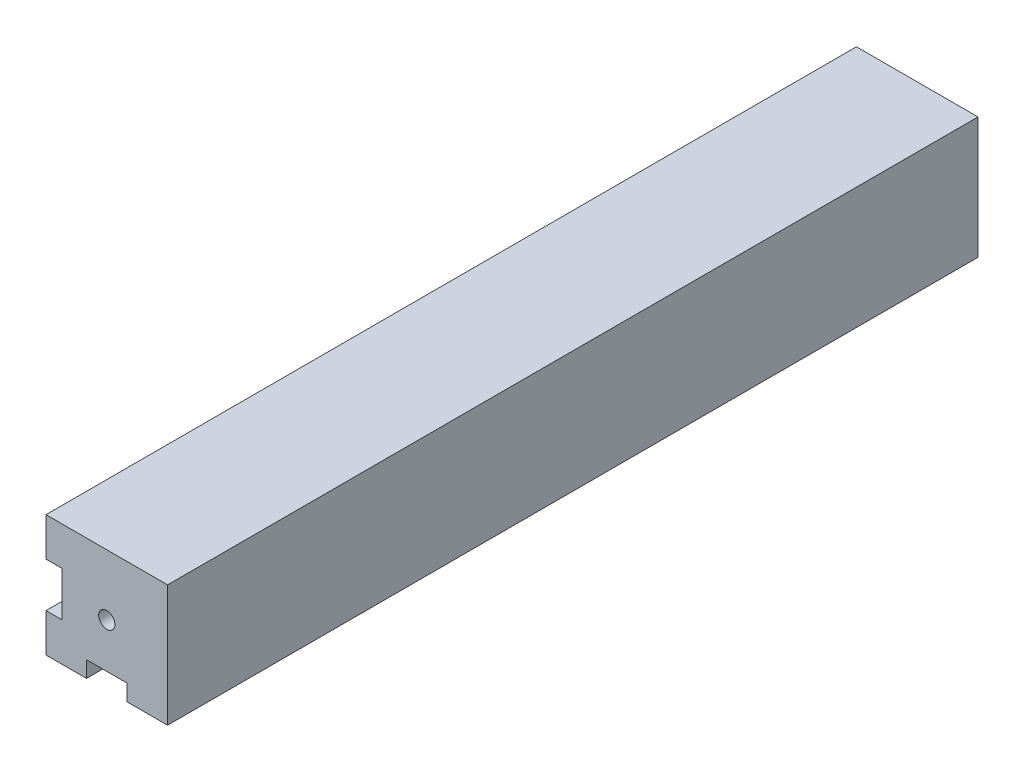
ISO-10303-21;
HEADER;
FILE_DESCRIPTION(('STEP AP214'),'2;1');
FILE_NAME('part.step','',(''),(''),'','','');
FILE_SCHEMA(('AUTOMOTIVE_DESIGN { 1 0 10303 214 1 1 1 1 }'));
ENDSEC;
DATA;
#1=APPLICATION_CONTEXT('core data for automotive mechanical design processes');
#2=APPLICATION_PROTOCOL_DEFINITION('international standard','automotive_design',2000,#1);
#3=PRODUCT_CONTEXT('',#1,'mechanical');
#4=PRODUCT('Part','Part','',(#3));
#5=PRODUCT_RELATED_PRODUCT_CATEGORY('part','',(#4));
#6=PRODUCT_DEFINITION_FORMATION('','',#4);
#7=PRODUCT_DEFINITION_CONTEXT('part definition',#1,'design');
#8=PRODUCT_DEFINITION('design','',#6,#7);
#9=PRODUCT_DEFINITION_SHAPE('','',#8);
#10=(LENGTH_UNIT() NAMED_UNIT(*) SI_UNIT(.MILLI.,.METRE.));
#11=(NAMED_UNIT(*) PLANE_ANGLE_UNIT() SI_UNIT($,.RADIAN.));
#12=(NAMED_UNIT(*) SI_UNIT($,.STERADIAN.) SOLID_ANGLE_UNIT());
#13=UNCERTAINTY_MEASURE_WITH_UNIT(LENGTH_MEASURE(1.E-05),#10,'distance_accuracy_value','');
#14=(GEOMETRIC_REPRESENTATION_CONTEXT(3) GLOBAL_UNCERTAINTY_ASSIGNED_CONTEXT((#13)) GLOBAL_UNIT_ASSIGNED_CONTEXT((#10,
#11,#12)) REPRESENTATION_CONTEXT('',''));
#15=CARTESIAN_POINT('',(0.,0.,0.));
#16=DIRECTION('',(0.,0.,1.));
#17=DIRECTION('',(1.,0.,0.));
#18=AXIS2_PLACEMENT_3D('',#15,#16,#17);
#19=CARTESIAN_POINT('',(-15.,-15.,-200.));
#20=DIRECTION('',(1.,0.,0.));
#21=DIRECTION('',(0.,0.,1.));
#22=AXIS2_PLACEMENT_3D('',#19,#20,#21);
#23=PLANE('',#22);
#24=DIRECTION('',(0.,-1.,0.));
#25=VECTOR('',#24,1.);
#26=CARTESIAN_POINT('',(-15.,-15.,-200.));
#27=LINE('',#26,#25);
#28=CARTESIAN_POINT('',(-15.,-5.5,-200.));
#29=VERTEX_POINT('',#28);
#30=CARTESIAN_POINT('',(-15.,-15.,-200.));
#31=VERTEX_POINT('',#30);
#32=EDGE_CURVE('E210',#29,#31,#27,.T.);
#33=ORIENTED_EDGE('',*,*,#32,.T.);
#34=DIRECTION('',(0.,0.,1.));
#35=VECTOR('',#34,1.);
#36=CARTESIAN_POINT('',(-15.,-15.,-200.));
#37=LINE('',#36,#35);
#38=CARTESIAN_POINT('',(-15.,-15.,0.));
#39=VERTEX_POINT('',#38);
#40=EDGE_CURVE('E232',#31,#39,#37,.T.);
#41=ORIENTED_EDGE('',*,*,#40,.T.);
#42=DIRECTION('',(0.,-1.,0.));
#43=VECTOR('',#42,1.);
#44=CARTESIAN_POINT('',(-15.,-15.,0.));
#45=LINE('',#44,#43);
#46=CARTESIAN_POINT('',(-15.,-5.5,0.));
#47=VERTEX_POINT('',#46);
#48=EDGE_CURVE('E223',#47,#39,#45,.T.);
#49=ORIENTED_EDGE('',*,*,#48,.F.);
#50=DIRECTION('',(0.,0.,1.));
#51=VECTOR('',#50,1.);
#52=CARTESIAN_POINT('',(-15.,-5.5,-200.));
#53=LINE('',#52,#51);
#54=EDGE_CURVE('E177',#29,#47,#53,.T.);
#55=ORIENTED_EDGE('',*,*,#54,.F.);
#56=EDGE_LOOP('',(#33,#41,#49,#55));
#57=FACE_BOUND('',#56,.T.);
#58=ADVANCED_FACE('F43',(#57),#23,.F.);
#59=CARTESIAN_POINT('',(-15.,-15.,-200.));
#60=DIRECTION('',(0.,1.,0.));
#61=DIRECTION('',(0.,0.,-1.));
#62=AXIS2_PLACEMENT_3D('',#59,#60,#61);
#63=PLANE('',#62);
#64=DIRECTION('',(1.,0.,0.));
#65=VECTOR('',#64,1.);
#66=CARTESIAN_POINT('',(-15.,-15.,0.));
#67=LINE('',#66,#65);
#68=CARTESIAN_POINT('',(-5.,-15.,0.));
#69=VERTEX_POINT('',#68);
#70=EDGE_CURVE('E207',#39,#69,#67,.T.);
#71=ORIENTED_EDGE('',*,*,#70,.F.);
#72=ORIENTED_EDGE('',*,*,#40,.F.);
#73=DIRECTION('',(1.,0.,0.));
#74=VECTOR('',#73,1.);
#75=CARTESIAN_POINT('',(-15.,-15.,-200.));
#76=LINE('',#75,#74);
#77=CARTESIAN_POINT('',(-5.,-15.,-200.));
#78=VERTEX_POINT('',#77);
#79=EDGE_CURVE('E215',#31,#78,#76,.T.);
#80=ORIENTED_EDGE('',*,*,#79,.T.);
#81=DIRECTION('',(0.,0.,-1.));
#82=VECTOR('',#81,1.);
#83=CARTESIAN_POINT('',(-5.,-15.,-200.));
#84=LINE('',#83,#82);
#85=EDGE_CURVE('E144',#69,#78,#84,.T.);
#86=ORIENTED_EDGE('',*,*,#85,.F.);
#87=EDGE_LOOP('',(#71,#72,#80,#86));
#88=FACE_BOUND('',#87,.T.);
#89=ADVANCED_FACE('F270',(#88),#63,.F.);
#90=CARTESIAN_POINT('',(15.,-15.,-200.));
#91=DIRECTION('',(-1.,0.,0.));
#92=DIRECTION('',(0.,0.,-1.));
#93=AXIS2_PLACEMENT_3D('',#90,#91,#92);
#94=PLANE('',#93);
#95=DIRECTION('',(0.,1.,0.));
#96=VECTOR('',#95,1.);
#97=CARTESIAN_POINT('',(15.,-15.,0.));
#98=LINE('',#97,#96);
#99=CARTESIAN_POINT('',(15.,-15.,0.));
#100=VERTEX_POINT('',#99);
#101=CARTESIAN_POINT('',(15.,15.,0.));
#102=VERTEX_POINT('',#101);
#103=EDGE_CURVE('E194',#100,#102,#98,.T.);
#104=ORIENTED_EDGE('',*,*,#103,.F.);
#105=DIRECTION('',(0.,0.,1.));
#106=VECTOR('',#105,1.);
#107=CARTESIAN_POINT('',(15.,-15.,-200.));
#108=LINE('',#107,#106);
#109=CARTESIAN_POINT('',(15.,-15.,-200.));
#110=VERTEX_POINT('',#109);
#111=EDGE_CURVE('E217',#110,#100,#108,.T.);
#112=ORIENTED_EDGE('',*,*,#111,.F.);
#113=DIRECTION('',(0.,1.,0.));
#114=VECTOR('',#113,1.);
#115=CARTESIAN_POINT('',(15.,-15.,-200.));
#116=LINE('',#115,#114);
#117=CARTESIAN_POINT('',(15.,15.,-200.));
#118=VERTEX_POINT('',#117);
#119=EDGE_CURVE('E203',#110,#118,#116,.T.);
#120=ORIENTED_EDGE('',*,*,#119,.T.);
#121=DIRECTION('',(0.,0.,1.));
#122=VECTOR('',#121,1.);
#123=CARTESIAN_POINT('',(15.,15.,-200.));
#124=LINE('',#123,#122);
#125=EDGE_CURVE('E238',#118,#102,#124,.T.);
#126=ORIENTED_EDGE('',*,*,#125,.T.);
#127=EDGE_LOOP('',(#104,#112,#120,#126));
#128=FACE_BOUND('',#127,.T.);
#129=ADVANCED_FACE('F45',(#128),#94,.F.);
#130=CARTESIAN_POINT('',(-15.,15.,-200.));
#131=DIRECTION('',(0.,-1.,0.));
#132=DIRECTION('',(0.,0.,1.));
#133=AXIS2_PLACEMENT_3D('',#130,#131,#132);
#134=PLANE('',#133);
#135=DIRECTION('',(-1.,0.,0.));
#136=VECTOR('',#135,1.);
#137=CARTESIAN_POINT('',(-15.,15.,0.));
#138=LINE('',#137,#136);
#139=CARTESIAN_POINT('',(-15.,15.,0.));
#140=VERTEX_POINT('',#139);
#141=EDGE_CURVE('E220',#102,#140,#138,.T.);
#142=ORIENTED_EDGE('',*,*,#141,.F.);
#143=ORIENTED_EDGE('',*,*,#125,.F.);
#144=DIRECTION('',(-1.,0.,0.));
#145=VECTOR('',#144,1.);
#146=CARTESIAN_POINT('',(-15.,15.,-200.));
#147=LINE('',#146,#145);
#148=CARTESIAN_POINT('',(-15.,15.,-200.));
#149=VERTEX_POINT('',#148);
#150=EDGE_CURVE('E206',#118,#149,#147,.T.);
#151=ORIENTED_EDGE('',*,*,#150,.T.);
#152=DIRECTION('',(0.,0.,1.));
#153=VECTOR('',#152,1.);
#154=CARTESIAN_POINT('',(-15.,15.,-200.));
#155=LINE('',#154,#153);
#156=EDGE_CURVE('E235',#149,#140,#155,.T.);
#157=ORIENTED_EDGE('',*,*,#156,.T.);
#158=EDGE_LOOP('',(#142,#143,#151,#157));
#159=FACE_BOUND('',#158,.T.);
#160=ADVANCED_FACE('F248',(#159),#134,.F.);
#161=CARTESIAN_POINT('',(-15.,5.5,0.));
#162=VERTEX_POINT('',#161);
#163=EDGE_CURVE('E224',#140,#162,#45,.T.);
#164=ORIENTED_EDGE('',*,*,#163,.F.);
#165=ORIENTED_EDGE('',*,*,#156,.F.);
#166=CARTESIAN_POINT('',(-15.,5.5,-200.));
#167=VERTEX_POINT('',#166);
#168=EDGE_CURVE('E211',#149,#167,#27,.T.);
#169=ORIENTED_EDGE('',*,*,#168,.T.);
#170=DIRECTION('',(0.,0.,-1.));
#171=VECTOR('',#170,1.);
#172=CARTESIAN_POINT('',(-15.,5.5,-200.));
#173=LINE('',#172,#171);
#174=EDGE_CURVE('E158',#162,#167,#173,.T.);
#175=ORIENTED_EDGE('',*,*,#174,.F.);
#176=EDGE_LOOP('',(#164,#165,#169,#175));
#177=FACE_BOUND('',#176,.T.);
#178=ADVANCED_FACE('F246',(#177),#23,.F.);
#179=CARTESIAN_POINT('',(5.,-15.,-200.));
#180=VERTEX_POINT('',#179);
#181=EDGE_CURVE('E214',#180,#110,#76,.T.);
#182=ORIENTED_EDGE('',*,*,#181,.T.);
#183=ORIENTED_EDGE('',*,*,#111,.T.);
#184=CARTESIAN_POINT('',(5.,-15.,0.));
#185=VERTEX_POINT('',#184);
#186=EDGE_CURVE('E227',#185,#100,#67,.T.);
#187=ORIENTED_EDGE('',*,*,#186,.F.);
#188=DIRECTION('',(0.,0.,1.));
#189=VECTOR('',#188,1.);
#190=CARTESIAN_POINT('',(5.,-15.,-200.));
#191=LINE('',#190,#189);
#192=EDGE_CURVE('E180',#180,#185,#191,.T.);
#193=ORIENTED_EDGE('',*,*,#192,.F.);
#194=EDGE_LOOP('',(#182,#183,#187,#193));
#195=FACE_BOUND('',#194,.T.);
#196=ADVANCED_FACE('F278',(#195),#63,.F.);
#197=CARTESIAN_POINT('',(0.,0.,-200.));
#198=DIRECTION('',(0.,0.,1.));
#199=DIRECTION('',(-1.,0.,0.));
#200=AXIS2_PLACEMENT_3D('',#197,#198,#199);
#201=PLANE('',#200);
#202=ORIENTED_EDGE('',*,*,#79,.F.);
#203=ORIENTED_EDGE('',*,*,#32,.F.);
#204=DIRECTION('',(-1.,0.,0.));
#205=VECTOR('',#204,1.);
#206=CARTESIAN_POINT('',(-11.,-5.5,-200.));
#207=LINE('',#206,#205);
#208=CARTESIAN_POINT('',(-11.,-5.5,-200.));
#209=VERTEX_POINT('',#208);
#210=EDGE_CURVE('E162',#209,#29,#207,.T.);
#211=ORIENTED_EDGE('',*,*,#210,.F.);
#212=DIRECTION('',(0.,-1.,0.));
#213=VECTOR('',#212,1.);
#214=CARTESIAN_POINT('',(-11.,-5.5,-200.));
#215=LINE('',#214,#213);
#216=CARTESIAN_POINT('',(-11.,5.5,-200.));
#217=VERTEX_POINT('',#216);
#218=EDGE_CURVE('E171',#217,#209,#215,.T.);
#219=ORIENTED_EDGE('',*,*,#218,.F.);
#220=DIRECTION('',(1.,0.,0.));
#221=VECTOR('',#220,1.);
#222=CARTESIAN_POINT('',(-11.,5.5,-200.));
#223=LINE('',#222,#221);
#224=EDGE_CURVE('E167',#167,#217,#223,.T.);
#225=ORIENTED_EDGE('',*,*,#224,.F.);
#226=ORIENTED_EDGE('',*,*,#168,.F.);
#227=ORIENTED_EDGE('',*,*,#150,.F.);
#228=ORIENTED_EDGE('',*,*,#119,.F.);
#229=ORIENTED_EDGE('',*,*,#181,.F.);
#230=DIRECTION('',(0.,-1.,0.));
#231=VECTOR('',#230,1.);
#232=CARTESIAN_POINT('',(5.,-19.,-200.));
#233=LINE('',#232,#231);
#234=CARTESIAN_POINT('',(5.,-11.,-200.));
#235=VERTEX_POINT('',#234);
#236=EDGE_CURVE('E138',#235,#180,#233,.T.);
#237=ORIENTED_EDGE('',*,*,#236,.F.);
#238=DIRECTION('',(1.,0.,0.));
#239=VECTOR('',#238,1.);
#240=CARTESIAN_POINT('',(5.,-11.,-200.));
#241=LINE('',#240,#239);
#242=CARTESIAN_POINT('',(-5.,-11.,-200.));
#243=VERTEX_POINT('',#242);
#244=EDGE_CURVE('E133',#243,#235,#241,.T.);
#245=ORIENTED_EDGE('',*,*,#244,.F.);
#246=DIRECTION('',(0.,1.,0.));
#247=VECTOR('',#246,1.);
#248=CARTESIAN_POINT('',(-5.,-19.,-200.));
#249=LINE('',#248,#247);
#250=EDGE_CURVE('E141',#78,#243,#249,.T.);
#251=ORIENTED_EDGE('',*,*,#250,.F.);
#252=EDGE_LOOP('',(#202,#203,#211,#219,#225,#226,#227,#228,#229,#237,#245,#251));
#253=FACE_BOUND('',#252,.T.);
#254=CARTESIAN_POINT('',(-7.47058314323587,7.47058314323587,-200.));
#255=DIRECTION('',(0.,0.,1.));
#256=DIRECTION('',(1.,0.,0.));
#257=AXIS2_PLACEMENT_3D('',#254,#255,#256);
#258=CIRCLE('',#257,2.);
#259=CARTESIAN_POINT('',(-5.47058314323587,7.47058314323587,-200.));
#260=VERTEX_POINT('',#259);
#261=EDGE_CURVE('E195',#260,#260,#258,.T.);
#262=ORIENTED_EDGE('',*,*,#261,.T.);
#263=EDGE_LOOP('',(#262));
#264=FACE_BOUND('',#263,.T.);
#265=CARTESIAN_POINT('',(7.47058314323587,-7.47058314323587,-200.));
#266=DIRECTION('',(0.,0.,1.));
#267=DIRECTION('',(-1.,0.,0.));
#268=AXIS2_PLACEMENT_3D('',#265,#266,#267);
#269=CIRCLE('',#268,2.00000000000001);
#270=CARTESIAN_POINT('',(5.47058314323587,-7.47058314323587,-200.));
#271=VERTEX_POINT('',#270);
#272=EDGE_CURVE('E198',#271,#271,#269,.T.);
#273=ORIENTED_EDGE('',*,*,#272,.T.);
#274=EDGE_LOOP('',(#273));
#275=FACE_BOUND('',#274,.T.);
#276=ADVANCED_FACE('F149',(#253,#264,#275),#201,.F.);
#277=CARTESIAN_POINT('',(0.,0.,0.));
#278=DIRECTION('',(0.,0.,1.));
#279=DIRECTION('',(-1.,0.,0.));
#280=AXIS2_PLACEMENT_3D('',#277,#278,#279);
#281=PLANE('',#280);
#282=DIRECTION('',(0.,1.,0.));
#283=VECTOR('',#282,1.);
#284=CARTESIAN_POINT('',(-5.,0.,0.));
#285=LINE('',#284,#283);
#286=CARTESIAN_POINT('',(-5.,-11.,0.));
#287=VERTEX_POINT('',#286);
#288=EDGE_CURVE('E11',#69,#287,#285,.T.);
#289=ORIENTED_EDGE('',*,*,#288,.T.);
#290=DIRECTION('',(1.,0.,0.));
#291=VECTOR('',#290,1.);
#292=CARTESIAN_POINT('',(5.,-11.,0.));
#293=LINE('',#292,#291);
#294=CARTESIAN_POINT('',(5.,-11.,0.));
#295=VERTEX_POINT('',#294);
#296=EDGE_CURVE('E136',#287,#295,#293,.T.);
#297=ORIENTED_EDGE('',*,*,#296,.T.);
#298=DIRECTION('',(0.,-1.,0.));
#299=VECTOR('',#298,1.);
#300=CARTESIAN_POINT('',(5.,-19.,0.));
#301=LINE('',#300,#299);
#302=EDGE_CURVE('E147',#295,#185,#301,.T.);
#303=ORIENTED_EDGE('',*,*,#302,.T.);
#304=ORIENTED_EDGE('',*,*,#186,.T.);
#305=ORIENTED_EDGE('',*,*,#103,.T.);
#306=ORIENTED_EDGE('',*,*,#141,.T.);
#307=ORIENTED_EDGE('',*,*,#163,.T.);
#308=DIRECTION('',(1.,0.,0.));
#309=VECTOR('',#308,1.);
#310=CARTESIAN_POINT('',(0.,5.5,0.));
#311=LINE('',#310,#309);
#312=CARTESIAN_POINT('',(-11.,5.5,0.));
#313=VERTEX_POINT('',#312);
#314=EDGE_CURVE('E51',#162,#313,#311,.T.);
#315=ORIENTED_EDGE('',*,*,#314,.T.);
#316=DIRECTION('',(0.,-1.,0.));
#317=VECTOR('',#316,1.);
#318=CARTESIAN_POINT('',(-11.,-5.5,0.));
#319=LINE('',#318,#317);
#320=CARTESIAN_POINT('',(-11.,-5.5,0.));
#321=VERTEX_POINT('',#320);
#322=EDGE_CURVE('E156',#313,#321,#319,.T.);
#323=ORIENTED_EDGE('',*,*,#322,.T.);
#324=DIRECTION('',(-1.,0.,0.));
#325=VECTOR('',#324,1.);
#326=CARTESIAN_POINT('',(-11.,-5.5,0.));
#327=LINE('',#326,#325);
#328=EDGE_CURVE('E165',#321,#47,#327,.T.);
#329=ORIENTED_EDGE('',*,*,#328,.T.);
#330=ORIENTED_EDGE('',*,*,#48,.T.);
#331=ORIENTED_EDGE('',*,*,#70,.T.);
#332=EDGE_LOOP('',(#289,#297,#303,#304,#305,#306,#307,#315,#323,#329,#330,#331));
#333=FACE_BOUND('',#332,.T.);
#334=CARTESIAN_POINT('',(0.,0.,0.));
#335=DIRECTION('',(0.,0.,-1.));
#336=DIRECTION('',(-1.,0.,0.));
#337=AXIS2_PLACEMENT_3D('',#334,#335,#336);
#338=CIRCLE('',#337,2.);
#339=CARTESIAN_POINT('',(-2.,0.,0.));
#340=VERTEX_POINT('',#339);
#341=EDGE_CURVE('E184',#340,#340,#338,.T.);
#342=ORIENTED_EDGE('',*,*,#341,.T.);
#343=EDGE_LOOP('',(#342));
#344=FACE_BOUND('',#343,.T.);
#345=ADVANCED_FACE('F241',(#333,#344),#281,.T.);
#346=CARTESIAN_POINT('',(7.47058314323587,-7.47058314323587,-175.));
#347=DIRECTION('',(0.,0.,-1.));
#348=DIRECTION('',(1.,0.,0.));
#349=AXIS2_PLACEMENT_3D('',#346,#347,#348);
#350=CYLINDRICAL_SURFACE('',#349,2.00000000000001);
#351=CARTESIAN_POINT('',(7.47058314323587,-7.47058314323587,-175.));
#352=DIRECTION('',(0.,0.,1.));
#353=DIRECTION('',(-1.,0.,0.));
#354=AXIS2_PLACEMENT_3D('',#351,#352,#353);
#355=CIRCLE('',#354,2.00000000000001);
#356=CARTESIAN_POINT('',(5.47058314323587,-7.47058314323587,-175.));
#357=VERTEX_POINT('',#356);
#358=EDGE_CURVE('E188',#357,#357,#355,.T.);
#359=ORIENTED_EDGE('',*,*,#358,.T.);
#360=EDGE_LOOP('',(#359));
#361=FACE_BOUND('',#360,.T.);
#362=ORIENTED_EDGE('',*,*,#272,.F.);
#363=EDGE_LOOP('',(#362));
#364=FACE_BOUND('',#363,.T.);
#365=ADVANCED_FACE('F378',(#361,#364),#350,.F.);
#366=CARTESIAN_POINT('',(7.47058314323587,-7.47058314323587,-175.));
#367=DIRECTION('',(0.,0.,1.));
#368=DIRECTION('',(-1.,0.,0.));
#369=AXIS2_PLACEMENT_3D('',#366,#367,#368);
#370=PLANE('',#369);
#371=ORIENTED_EDGE('',*,*,#358,.F.);
#372=EDGE_LOOP('',(#371));
#373=FACE_BOUND('',#372,.T.);
#374=ADVANCED_FACE('F368',(#373),#370,.F.);
#375=CARTESIAN_POINT('',(-7.47058314323587,7.47058314323587,-175.));
#376=DIRECTION('',(0.,0.,-1.));
#377=DIRECTION('',(1.,0.,0.));
#378=AXIS2_PLACEMENT_3D('',#375,#376,#377);
#379=CYLINDRICAL_SURFACE('',#378,2.);
#380=CARTESIAN_POINT('',(-7.47058314323587,7.47058314323587,-175.));
#381=DIRECTION('',(0.,0.,1.));
#382=DIRECTION('',(1.,0.,0.));
#383=AXIS2_PLACEMENT_3D('',#380,#381,#382);
#384=CIRCLE('',#383,2.);
#385=CARTESIAN_POINT('',(-5.47058314323587,7.47058314323587,-175.));
#386=VERTEX_POINT('',#385);
#387=EDGE_CURVE('E191',#386,#386,#384,.T.);
#388=ORIENTED_EDGE('',*,*,#387,.T.);
#389=EDGE_LOOP('',(#388));
#390=FACE_BOUND('',#389,.T.);
#391=ORIENTED_EDGE('',*,*,#261,.F.);
#392=EDGE_LOOP('',(#391));
#393=FACE_BOUND('',#392,.T.);
#394=ADVANCED_FACE('F358',(#390,#393),#379,.F.);
#395=CARTESIAN_POINT('',(-7.47058314323587,7.47058314323587,-175.));
#396=DIRECTION('',(0.,0.,-1.));
#397=DIRECTION('',(1.,0.,0.));
#398=AXIS2_PLACEMENT_3D('',#395,#396,#397);
#399=PLANE('',#398);
#400=ORIENTED_EDGE('',*,*,#387,.F.);
#401=EDGE_LOOP('',(#400));
#402=FACE_BOUND('',#401,.T.);
#403=ADVANCED_FACE('F348',(#402),#399,.T.);
#404=CARTESIAN_POINT('',(0.,0.,-25.));
#405=DIRECTION('',(0.,0.,1.));
#406=DIRECTION('',(-1.,0.,0.));
#407=AXIS2_PLACEMENT_3D('',#404,#405,#406);
#408=CYLINDRICAL_SURFACE('',#407,2.);
#409=CARTESIAN_POINT('',(0.,0.,-25.));
#410=DIRECTION('',(0.,0.,-1.));
#411=DIRECTION('',(-1.,0.,0.));
#412=AXIS2_PLACEMENT_3D('',#409,#410,#411);
#413=CIRCLE('',#412,2.);
#414=CARTESIAN_POINT('',(-2.,0.,-25.));
#415=VERTEX_POINT('',#414);
#416=EDGE_CURVE('E185',#415,#415,#413,.T.);
#417=ORIENTED_EDGE('',*,*,#416,.T.);
#418=EDGE_LOOP('',(#417));
#419=FACE_BOUND('',#418,.T.);
#420=ORIENTED_EDGE('',*,*,#341,.F.);
#421=EDGE_LOOP('',(#420));
#422=FACE_BOUND('',#421,.T.);
#423=ADVANCED_FACE('F338',(#419,#422),#408,.F.);
#424=CARTESIAN_POINT('',(0.,0.,-25.));
#425=DIRECTION('',(0.,0.,1.));
#426=DIRECTION('',(-1.,0.,0.));
#427=AXIS2_PLACEMENT_3D('',#424,#425,#426);
#428=PLANE('',#427);
#429=ORIENTED_EDGE('',*,*,#416,.F.);
#430=EDGE_LOOP('',(#429));
#431=FACE_BOUND('',#430,.T.);
#432=ADVANCED_FACE('F265',(#431),#428,.T.);
#433=CARTESIAN_POINT('',(-11.,-5.5,-200.));
#434=DIRECTION('',(0.,-1.,0.));
#435=DIRECTION('',(0.,0.,1.));
#436=AXIS2_PLACEMENT_3D('',#433,#434,#435);
#437=PLANE('',#436);
#438=ORIENTED_EDGE('',*,*,#210,.T.);
#439=ORIENTED_EDGE('',*,*,#54,.T.);
#440=ORIENTED_EDGE('',*,*,#328,.F.);
#441=DIRECTION('',(0.,0.,1.));
#442=VECTOR('',#441,1.);
#443=CARTESIAN_POINT('',(-11.,-5.5,-200.));
#444=LINE('',#443,#442);
#445=EDGE_CURVE('E163',#209,#321,#444,.T.);
#446=ORIENTED_EDGE('',*,*,#445,.F.);
#447=EDGE_LOOP('',(#438,#439,#440,#446));
#448=FACE_BOUND('',#447,.T.);
#449=ADVANCED_FACE('F257',(#448),#437,.F.);
#450=CARTESIAN_POINT('',(-11.,5.5,-200.));
#451=DIRECTION('',(0.,1.,0.));
#452=DIRECTION('',(0.,0.,-1.));
#453=AXIS2_PLACEMENT_3D('',#450,#451,#452);
#454=PLANE('',#453);
#455=ORIENTED_EDGE('',*,*,#314,.F.);
#456=ORIENTED_EDGE('',*,*,#174,.T.);
#457=ORIENTED_EDGE('',*,*,#224,.T.);
#458=DIRECTION('',(0.,0.,1.));
#459=VECTOR('',#458,1.);
#460=CARTESIAN_POINT('',(-11.,5.5,-200.));
#461=LINE('',#460,#459);
#462=EDGE_CURVE('E160',#217,#313,#461,.T.);
#463=ORIENTED_EDGE('',*,*,#462,.T.);
#464=EDGE_LOOP('',(#455,#456,#457,#463));
#465=FACE_BOUND('',#464,.T.);
#466=ADVANCED_FACE('F254',(#465),#454,.F.);
#467=CARTESIAN_POINT('',(-11.,-5.5,-200.));
#468=DIRECTION('',(1.,0.,0.));
#469=DIRECTION('',(0.,0.,1.));
#470=AXIS2_PLACEMENT_3D('',#467,#468,#469);
#471=PLANE('',#470);
#472=ORIENTED_EDGE('',*,*,#322,.F.);
#473=ORIENTED_EDGE('',*,*,#462,.F.);
#474=ORIENTED_EDGE('',*,*,#218,.T.);
#475=ORIENTED_EDGE('',*,*,#445,.T.);
#476=EDGE_LOOP('',(#472,#473,#474,#475));
#477=FACE_BOUND('',#476,.T.);
#478=ADVANCED_FACE('F256',(#477),#471,.F.);
#479=CARTESIAN_POINT('',(-5.,-19.,-200.));
#480=DIRECTION('',(-1.,0.,0.));
#481=DIRECTION('',(0.,0.,-1.));
#482=AXIS2_PLACEMENT_3D('',#479,#480,#481);
#483=PLANE('',#482);
#484=ORIENTED_EDGE('',*,*,#288,.F.);
#485=ORIENTED_EDGE('',*,*,#85,.T.);
#486=ORIENTED_EDGE('',*,*,#250,.T.);
#487=DIRECTION('',(0.,0.,1.));
#488=VECTOR('',#487,1.);
#489=CARTESIAN_POINT('',(-5.,-11.,-200.));
#490=LINE('',#489,#488);
#491=EDGE_CURVE('E58',#243,#287,#490,.T.);
#492=ORIENTED_EDGE('',*,*,#491,.T.);
#493=EDGE_LOOP('',(#484,#485,#486,#492));
#494=FACE_BOUND('',#493,.T.);
#495=ADVANCED_FACE('F142',(#494),#483,.F.);
#496=CARTESIAN_POINT('',(5.,-19.,-200.));
#497=DIRECTION('',(1.,0.,0.));
#498=DIRECTION('',(0.,0.,1.));
#499=AXIS2_PLACEMENT_3D('',#496,#497,#498);
#500=PLANE('',#499);
#501=ORIENTED_EDGE('',*,*,#236,.T.);
#502=ORIENTED_EDGE('',*,*,#192,.T.);
#503=ORIENTED_EDGE('',*,*,#302,.F.);
#504=DIRECTION('',(0.,0.,1.));
#505=VECTOR('',#504,1.);
#506=CARTESIAN_POINT('',(5.,-11.,-200.));
#507=LINE('',#506,#505);
#508=EDGE_CURVE('E137',#235,#295,#507,.T.);
#509=ORIENTED_EDGE('',*,*,#508,.F.);
#510=EDGE_LOOP('',(#501,#502,#503,#509));
#511=FACE_BOUND('',#510,.T.);
#512=ADVANCED_FACE('F297',(#511),#500,.F.);
#513=CARTESIAN_POINT('',(5.,-11.,-200.));
#514=DIRECTION('',(0.,1.,0.));
#515=DIRECTION('',(0.,0.,-1.));
#516=AXIS2_PLACEMENT_3D('',#513,#514,#515);
#517=PLANE('',#516);
#518=ORIENTED_EDGE('',*,*,#296,.F.);
#519=ORIENTED_EDGE('',*,*,#491,.F.);
#520=ORIENTED_EDGE('',*,*,#244,.T.);
#521=ORIENTED_EDGE('',*,*,#508,.T.);
#522=EDGE_LOOP('',(#518,#519,#520,#521));
#523=FACE_BOUND('',#522,.T.);
#524=ADVANCED_FACE('F131',(#523),#517,.F.);
#525=CLOSED_SHELL('',(#58,#89,#129,#160,#178,#196,#276,#345,#365,#374,#394,#403,#423,#432,#449,
#466,#478,#495,#512,#524));
#526=MANIFOLD_SOLID_BREP('B2',#525);
#527=ADVANCED_BREP_SHAPE_REPRESENTATION('',(#18,#526),#14);
#528=SHAPE_DEFINITION_REPRESENTATION(#9,#527);
ENDSEC;
END-ISO-10303-21;
